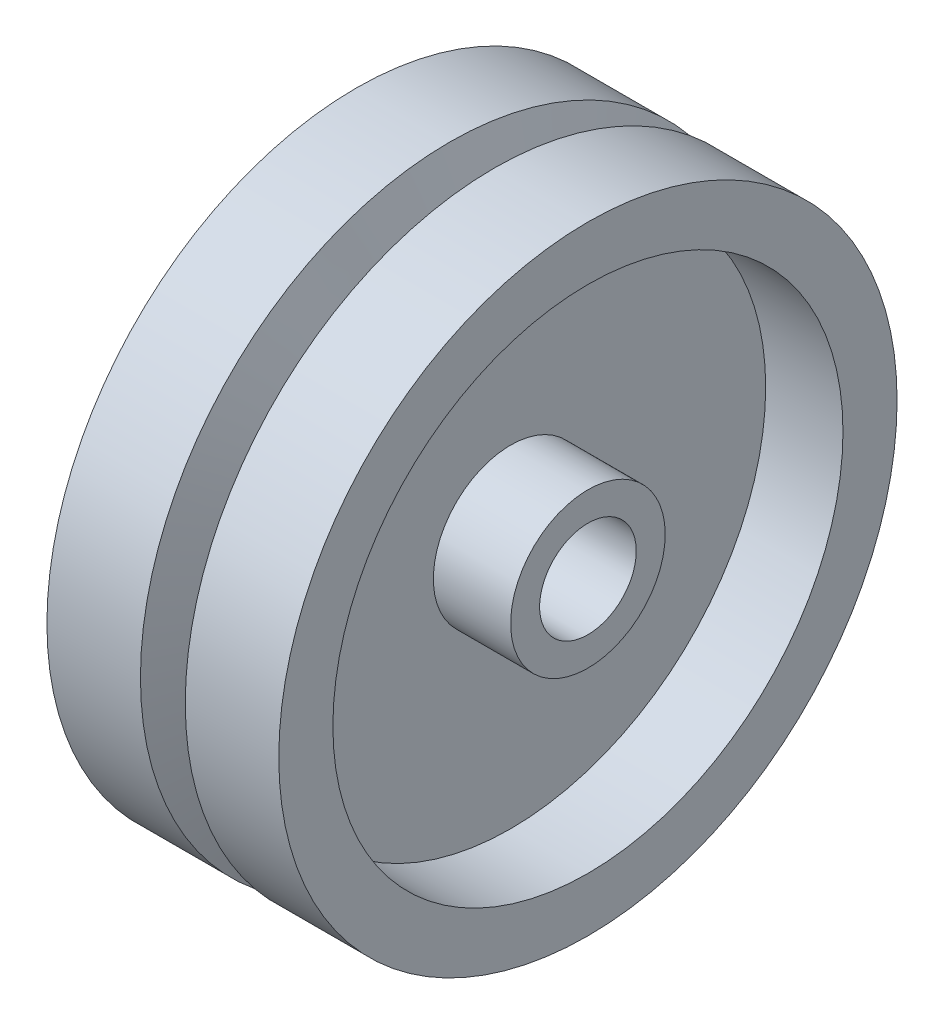
ISO-10303-21;
HEADER;
FILE_DESCRIPTION(('STEP AP214'),'2;1');
FILE_NAME('part.step','',(''),(''),'','','');
FILE_SCHEMA(('AUTOMOTIVE_DESIGN { 1 0 10303 214 1 1 1 1 }'));
ENDSEC;
DATA;
#1=APPLICATION_CONTEXT('core data for automotive mechanical design processes');
#2=APPLICATION_PROTOCOL_DEFINITION('international standard','automotive_design',2000,#1);
#3=PRODUCT_CONTEXT('',#1,'mechanical');
#4=PRODUCT('Part','Part','',(#3));
#5=PRODUCT_RELATED_PRODUCT_CATEGORY('part','',(#4));
#6=PRODUCT_DEFINITION_FORMATION('','',#4);
#7=PRODUCT_DEFINITION_CONTEXT('part definition',#1,'design');
#8=PRODUCT_DEFINITION('design','',#6,#7);
#9=PRODUCT_DEFINITION_SHAPE('','',#8);
#10=(LENGTH_UNIT() NAMED_UNIT(*) SI_UNIT(.MILLI.,.METRE.));
#11=(NAMED_UNIT(*) PLANE_ANGLE_UNIT() SI_UNIT($,.RADIAN.));
#12=(NAMED_UNIT(*) SI_UNIT($,.STERADIAN.) SOLID_ANGLE_UNIT());
#13=UNCERTAINTY_MEASURE_WITH_UNIT(LENGTH_MEASURE(1.E-05),#10,'distance_accuracy_value','');
#14=(GEOMETRIC_REPRESENTATION_CONTEXT(3) GLOBAL_UNCERTAINTY_ASSIGNED_CONTEXT((#13)) GLOBAL_UNIT_ASSIGNED_CONTEXT((#10,
#11,#12)) REPRESENTATION_CONTEXT('',''));
#15=CARTESIAN_POINT('',(0.,0.,0.));
#16=DIRECTION('',(0.,0.,1.));
#17=DIRECTION('',(1.,0.,0.));
#18=AXIS2_PLACEMENT_3D('',#15,#16,#17);
#19=CARTESIAN_POINT('',(2.5,5.,0.));
#20=DIRECTION('',(1.,0.,0.));
#21=DIRECTION('',(0.,0.,-1.));
#22=AXIS2_PLACEMENT_3D('',#19,#20,#21);
#23=PLANE('',#22);
#24=CARTESIAN_POINT('',(2.5,0.,0.));
#25=DIRECTION('',(1.,0.,0.));
#26=DIRECTION('',(0.,0.,-1.));
#27=AXIS2_PLACEMENT_3D('',#24,#25,#26);
#28=CIRCLE('',#27,16.5);
#29=CARTESIAN_POINT('',(2.5,0.,-16.5));
#30=VERTEX_POINT('',#29);
#31=EDGE_CURVE('E80',#30,#30,#28,.T.);
#32=ORIENTED_EDGE('',*,*,#31,.T.);
#33=EDGE_LOOP('',(#32));
#34=FACE_BOUND('',#33,.T.);
#35=CARTESIAN_POINT('',(2.5,0.,0.));
#36=DIRECTION('',(1.,0.,0.));
#37=DIRECTION('',(0.,0.,-1.));
#38=AXIS2_PLACEMENT_3D('',#35,#36,#37);
#39=CIRCLE('',#38,5.);
#40=CARTESIAN_POINT('',(2.5,0.,-5.));
#41=VERTEX_POINT('',#40);
#42=EDGE_CURVE('E10',#41,#41,#39,.T.);
#43=ORIENTED_EDGE('',*,*,#42,.F.);
#44=EDGE_LOOP('',(#43));
#45=FACE_BOUND('',#44,.T.);
#46=ADVANCED_FACE('F31',(#34,#45),#23,.T.);
#47=CARTESIAN_POINT('',(0.,0.,0.));
#48=DIRECTION('',(1.,0.,0.));
#49=DIRECTION('',(0.,0.,-1.));
#50=AXIS2_PLACEMENT_3D('',#47,#48,#49);
#51=CYLINDRICAL_SURFACE('',#50,5.);
#52=ORIENTED_EDGE('',*,*,#42,.T.);
#53=EDGE_LOOP('',(#52));
#54=FACE_BOUND('',#53,.T.);
#55=CARTESIAN_POINT('',(7.5,0.,0.));
#56=DIRECTION('',(1.,0.,0.));
#57=DIRECTION('',(0.,0.,-1.));
#58=AXIS2_PLACEMENT_3D('',#55,#56,#57);
#59=CIRCLE('',#58,5.);
#60=CARTESIAN_POINT('',(7.5,0.,-5.));
#61=VERTEX_POINT('',#60);
#62=EDGE_CURVE('E37',#61,#61,#59,.T.);
#63=ORIENTED_EDGE('',*,*,#62,.F.);
#64=EDGE_LOOP('',(#63));
#65=FACE_BOUND('',#64,.T.);
#66=ADVANCED_FACE('F98',(#54,#65),#51,.T.);
#67=CARTESIAN_POINT('',(7.5,3.125,0.));
#68=DIRECTION('',(1.,0.,0.));
#69=DIRECTION('',(0.,0.,-1.));
#70=AXIS2_PLACEMENT_3D('',#67,#68,#69);
#71=PLANE('',#70);
#72=ORIENTED_EDGE('',*,*,#62,.T.);
#73=EDGE_LOOP('',(#72));
#74=FACE_BOUND('',#73,.T.);
#75=CARTESIAN_POINT('',(7.5,0.,0.));
#76=DIRECTION('',(1.,0.,0.));
#77=DIRECTION('',(0.,0.,-1.));
#78=AXIS2_PLACEMENT_3D('',#75,#76,#77);
#79=CIRCLE('',#78,3.125);
#80=CARTESIAN_POINT('',(7.5,0.,-3.125));
#81=VERTEX_POINT('',#80);
#82=EDGE_CURVE('E41',#81,#81,#79,.T.);
#83=ORIENTED_EDGE('',*,*,#82,.F.);
#84=EDGE_LOOP('',(#83));
#85=FACE_BOUND('',#84,.T.);
#86=ADVANCED_FACE('F102',(#74,#85),#71,.T.);
#87=CARTESIAN_POINT('',(0.,0.,0.));
#88=DIRECTION('',(1.,0.,0.));
#89=DIRECTION('',(0.,0.,-1.));
#90=AXIS2_PLACEMENT_3D('',#87,#88,#89);
#91=CYLINDRICAL_SURFACE('',#90,3.125);
#92=ORIENTED_EDGE('',*,*,#82,.T.);
#93=EDGE_LOOP('',(#92));
#94=FACE_BOUND('',#93,.T.);
#95=CARTESIAN_POINT('',(-7.5,0.,0.));
#96=DIRECTION('',(1.,0.,0.));
#97=DIRECTION('',(0.,0.,-1.));
#98=AXIS2_PLACEMENT_3D('',#95,#96,#97);
#99=CIRCLE('',#98,3.125);
#100=CARTESIAN_POINT('',(-7.5,0.,-3.125));
#101=VERTEX_POINT('',#100);
#102=EDGE_CURVE('E45',#101,#101,#99,.T.);
#103=ORIENTED_EDGE('',*,*,#102,.F.);
#104=EDGE_LOOP('',(#103));
#105=FACE_BOUND('',#104,.T.);
#106=ADVANCED_FACE('F106',(#94,#105),#91,.F.);
#107=CARTESIAN_POINT('',(-7.5,3.125,0.));
#108=DIRECTION('',(-1.,0.,0.));
#109=DIRECTION('',(0.,0.,1.));
#110=AXIS2_PLACEMENT_3D('',#107,#108,#109);
#111=PLANE('',#110);
#112=ORIENTED_EDGE('',*,*,#102,.T.);
#113=EDGE_LOOP('',(#112));
#114=FACE_BOUND('',#113,.T.);
#115=CARTESIAN_POINT('',(-7.5,0.,0.));
#116=DIRECTION('',(1.,0.,0.));
#117=DIRECTION('',(0.,0.,-1.));
#118=AXIS2_PLACEMENT_3D('',#115,#116,#117);
#119=CIRCLE('',#118,5.);
#120=CARTESIAN_POINT('',(-7.5,0.,-5.));
#121=VERTEX_POINT('',#120);
#122=EDGE_CURVE('E50',#121,#121,#119,.T.);
#123=ORIENTED_EDGE('',*,*,#122,.F.);
#124=EDGE_LOOP('',(#123));
#125=FACE_BOUND('',#124,.T.);
#126=ADVANCED_FACE('F112',(#114,#125),#111,.T.);
#127=CARTESIAN_POINT('',(0.,0.,0.));
#128=DIRECTION('',(1.,0.,0.));
#129=DIRECTION('',(0.,0.,-1.));
#130=AXIS2_PLACEMENT_3D('',#127,#128,#129);
#131=CYLINDRICAL_SURFACE('',#130,5.);
#132=ORIENTED_EDGE('',*,*,#122,.T.);
#133=EDGE_LOOP('',(#132));
#134=FACE_BOUND('',#133,.T.);
#135=CARTESIAN_POINT('',(-2.5,0.,0.));
#136=DIRECTION('',(1.,0.,0.));
#137=DIRECTION('',(0.,0.,-1.));
#138=AXIS2_PLACEMENT_3D('',#135,#136,#137);
#139=CIRCLE('',#138,5.);
#140=CARTESIAN_POINT('',(-2.5,0.,-5.));
#141=VERTEX_POINT('',#140);
#142=EDGE_CURVE('E53',#141,#141,#139,.T.);
#143=ORIENTED_EDGE('',*,*,#142,.F.);
#144=EDGE_LOOP('',(#143));
#145=FACE_BOUND('',#144,.T.);
#146=ADVANCED_FACE('F116',(#134,#145),#131,.T.);
#147=CARTESIAN_POINT('',(-2.5,5.,0.));
#148=DIRECTION('',(-1.,0.,0.));
#149=DIRECTION('',(0.,0.,1.));
#150=AXIS2_PLACEMENT_3D('',#147,#148,#149);
#151=PLANE('',#150);
#152=ORIENTED_EDGE('',*,*,#142,.T.);
#153=EDGE_LOOP('',(#152));
#154=FACE_BOUND('',#153,.T.);
#155=CARTESIAN_POINT('',(-2.5,0.,0.));
#156=DIRECTION('',(1.,0.,0.));
#157=DIRECTION('',(0.,0.,-1.));
#158=AXIS2_PLACEMENT_3D('',#155,#156,#157);
#159=CIRCLE('',#158,16.5);
#160=CARTESIAN_POINT('',(-2.5,0.,-16.5));
#161=VERTEX_POINT('',#160);
#162=EDGE_CURVE('E56',#161,#161,#159,.T.);
#163=ORIENTED_EDGE('',*,*,#162,.F.);
#164=EDGE_LOOP('',(#163));
#165=FACE_BOUND('',#164,.T.);
#166=ADVANCED_FACE('F120',(#154,#165),#151,.T.);
#167=CARTESIAN_POINT('',(0.,0.,0.));
#168=DIRECTION('',(1.,0.,0.));
#169=DIRECTION('',(0.,0.,-1.));
#170=AXIS2_PLACEMENT_3D('',#167,#168,#169);
#171=CYLINDRICAL_SURFACE('',#170,16.5);
#172=ORIENTED_EDGE('',*,*,#162,.T.);
#173=EDGE_LOOP('',(#172));
#174=FACE_BOUND('',#173,.T.);
#175=CARTESIAN_POINT('',(-7.5,0.,0.));
#176=DIRECTION('',(1.,0.,0.));
#177=DIRECTION('',(0.,0.,-1.));
#178=AXIS2_PLACEMENT_3D('',#175,#176,#177);
#179=CIRCLE('',#178,16.5);
#180=CARTESIAN_POINT('',(-7.5,0.,-16.5));
#181=VERTEX_POINT('',#180);
#182=EDGE_CURVE('E59',#181,#181,#179,.T.);
#183=ORIENTED_EDGE('',*,*,#182,.F.);
#184=EDGE_LOOP('',(#183));
#185=FACE_BOUND('',#184,.T.);
#186=ADVANCED_FACE('F124',(#174,#185),#171,.F.);
#187=CARTESIAN_POINT('',(-7.5,16.5,0.));
#188=DIRECTION('',(-1.,0.,0.));
#189=DIRECTION('',(0.,0.,1.));
#190=AXIS2_PLACEMENT_3D('',#187,#188,#189);
#191=PLANE('',#190);
#192=ORIENTED_EDGE('',*,*,#182,.T.);
#193=EDGE_LOOP('',(#192));
#194=FACE_BOUND('',#193,.T.);
#195=CARTESIAN_POINT('',(-7.5,0.,0.));
#196=DIRECTION('',(1.,0.,0.));
#197=DIRECTION('',(0.,0.,-1.));
#198=AXIS2_PLACEMENT_3D('',#195,#196,#197);
#199=CIRCLE('',#198,20.);
#200=CARTESIAN_POINT('',(-7.5,0.,-20.));
#201=VERTEX_POINT('',#200);
#202=EDGE_CURVE('E62',#201,#201,#199,.T.);
#203=ORIENTED_EDGE('',*,*,#202,.F.);
#204=EDGE_LOOP('',(#203));
#205=FACE_BOUND('',#204,.T.);
#206=ADVANCED_FACE('F128',(#194,#205),#191,.T.);
#207=CARTESIAN_POINT('',(0.,0.,0.));
#208=DIRECTION('',(1.,0.,0.));
#209=DIRECTION('',(0.,0.,-1.));
#210=AXIS2_PLACEMENT_3D('',#207,#208,#209);
#211=CYLINDRICAL_SURFACE('',#210,20.);
#212=ORIENTED_EDGE('',*,*,#202,.T.);
#213=EDGE_LOOP('',(#212));
#214=FACE_BOUND('',#213,.T.);
#215=CARTESIAN_POINT('',(-1.44974746830423,0.,0.));
#216=DIRECTION('',(1.,0.,0.));
#217=DIRECTION('',(0.,0.,-1.));
#218=AXIS2_PLACEMENT_3D('',#215,#216,#217);
#219=CIRCLE('',#218,20.);
#220=CARTESIAN_POINT('',(-1.44974746830423,0.,-20.));
#221=VERTEX_POINT('',#220);
#222=EDGE_CURVE('E65',#221,#221,#219,.T.);
#223=ORIENTED_EDGE('',*,*,#222,.F.);
#224=EDGE_LOOP('',(#223));
#225=FACE_BOUND('',#224,.T.);
#226=ADVANCED_FACE('F132',(#214,#225),#211,.T.);
#227=CARTESIAN_POINT('',(0.,0.,0.));
#228=DIRECTION('',(-1.,0.,0.));
#229=DIRECTION('',(0.,0.,1.));
#230=AXIS2_PLACEMENT_3D('',#227,#228,#229);
#231=CONICAL_SURFACE('',#230,16.5000000000039,1.17809724509617);
#232=ORIENTED_EDGE('',*,*,#222,.T.);
#233=EDGE_LOOP('',(#232));
#234=FACE_BOUND('',#233,.T.);
#235=CARTESIAN_POINT('',(0.,0.,0.));
#236=DIRECTION('',(1.,0.,0.));
#237=DIRECTION('',(0.,0.,-1.));
#238=AXIS2_PLACEMENT_3D('',#235,#236,#237);
#239=CIRCLE('',#238,16.5000000000039);
#240=CARTESIAN_POINT('',(0.,0.,-16.5000000000039));
#241=VERTEX_POINT('',#240);
#242=EDGE_CURVE('E68',#241,#241,#239,.T.);
#243=ORIENTED_EDGE('',*,*,#242,.F.);
#244=EDGE_LOOP('',(#243));
#245=FACE_BOUND('',#244,.T.);
#246=ADVANCED_FACE('F136',(#234,#245),#231,.T.);
#247=CARTESIAN_POINT('',(1.44974746830423,0.,0.));
#248=DIRECTION('',(1.,0.,0.));
#249=DIRECTION('',(0.,0.,-1.));
#250=AXIS2_PLACEMENT_3D('',#247,#248,#249);
#251=CONICAL_SURFACE('',#250,20.,1.17809724509617);
#252=ORIENTED_EDGE('',*,*,#242,.T.);
#253=EDGE_LOOP('',(#252));
#254=FACE_BOUND('',#253,.T.);
#255=CARTESIAN_POINT('',(1.44974746830423,0.,0.));
#256=DIRECTION('',(1.,0.,0.));
#257=DIRECTION('',(0.,0.,-1.));
#258=AXIS2_PLACEMENT_3D('',#255,#256,#257);
#259=CIRCLE('',#258,20.);
#260=CARTESIAN_POINT('',(1.44974746830423,0.,-20.));
#261=VERTEX_POINT('',#260);
#262=EDGE_CURVE('E71',#261,#261,#259,.T.);
#263=ORIENTED_EDGE('',*,*,#262,.F.);
#264=EDGE_LOOP('',(#263));
#265=FACE_BOUND('',#264,.T.);
#266=ADVANCED_FACE('F140',(#254,#265),#251,.T.);
#267=CARTESIAN_POINT('',(0.,0.,0.));
#268=DIRECTION('',(1.,0.,0.));
#269=DIRECTION('',(0.,0.,-1.));
#270=AXIS2_PLACEMENT_3D('',#267,#268,#269);
#271=CYLINDRICAL_SURFACE('',#270,20.);
#272=ORIENTED_EDGE('',*,*,#262,.T.);
#273=EDGE_LOOP('',(#272));
#274=FACE_BOUND('',#273,.T.);
#275=CARTESIAN_POINT('',(7.5,0.,0.));
#276=DIRECTION('',(1.,0.,0.));
#277=DIRECTION('',(0.,0.,-1.));
#278=AXIS2_PLACEMENT_3D('',#275,#276,#277);
#279=CIRCLE('',#278,20.);
#280=CARTESIAN_POINT('',(7.5,0.,-20.));
#281=VERTEX_POINT('',#280);
#282=EDGE_CURVE('E74',#281,#281,#279,.T.);
#283=ORIENTED_EDGE('',*,*,#282,.F.);
#284=EDGE_LOOP('',(#283));
#285=FACE_BOUND('',#284,.T.);
#286=ADVANCED_FACE('F94',(#274,#285),#271,.T.);
#287=CARTESIAN_POINT('',(7.5,16.5,0.));
#288=DIRECTION('',(1.,0.,0.));
#289=DIRECTION('',(0.,0.,-1.));
#290=AXIS2_PLACEMENT_3D('',#287,#288,#289);
#291=PLANE('',#290);
#292=ORIENTED_EDGE('',*,*,#282,.T.);
#293=EDGE_LOOP('',(#292));
#294=FACE_BOUND('',#293,.T.);
#295=CARTESIAN_POINT('',(7.5,0.,0.));
#296=DIRECTION('',(1.,0.,0.));
#297=DIRECTION('',(0.,0.,-1.));
#298=AXIS2_PLACEMENT_3D('',#295,#296,#297);
#299=CIRCLE('',#298,16.5);
#300=CARTESIAN_POINT('',(7.5,0.,-16.5));
#301=VERTEX_POINT('',#300);
#302=EDGE_CURVE('E77',#301,#301,#299,.T.);
#303=ORIENTED_EDGE('',*,*,#302,.F.);
#304=EDGE_LOOP('',(#303));
#305=FACE_BOUND('',#304,.T.);
#306=ADVANCED_FACE('F88',(#294,#305),#291,.T.);
#307=CARTESIAN_POINT('',(0.,0.,0.));
#308=DIRECTION('',(1.,0.,0.));
#309=DIRECTION('',(0.,0.,-1.));
#310=AXIS2_PLACEMENT_3D('',#307,#308,#309);
#311=CYLINDRICAL_SURFACE('',#310,16.5);
#312=ORIENTED_EDGE('',*,*,#302,.T.);
#313=EDGE_LOOP('',(#312));
#314=FACE_BOUND('',#313,.T.);
#315=ORIENTED_EDGE('',*,*,#31,.F.);
#316=EDGE_LOOP('',(#315));
#317=FACE_BOUND('',#316,.T.);
#318=ADVANCED_FACE('F86',(#314,#317),#311,.F.);
#319=CLOSED_SHELL('',(#46,#66,#86,#106,#126,#146,#166,#186,#206,#226,#246,#266,#286,#306,#318));
#320=MANIFOLD_SOLID_BREP('B2',#319);
#321=ADVANCED_BREP_SHAPE_REPRESENTATION('',(#18,#320),#14);
#322=SHAPE_DEFINITION_REPRESENTATION(#9,#321);
ENDSEC;
END-ISO-10303-21;
